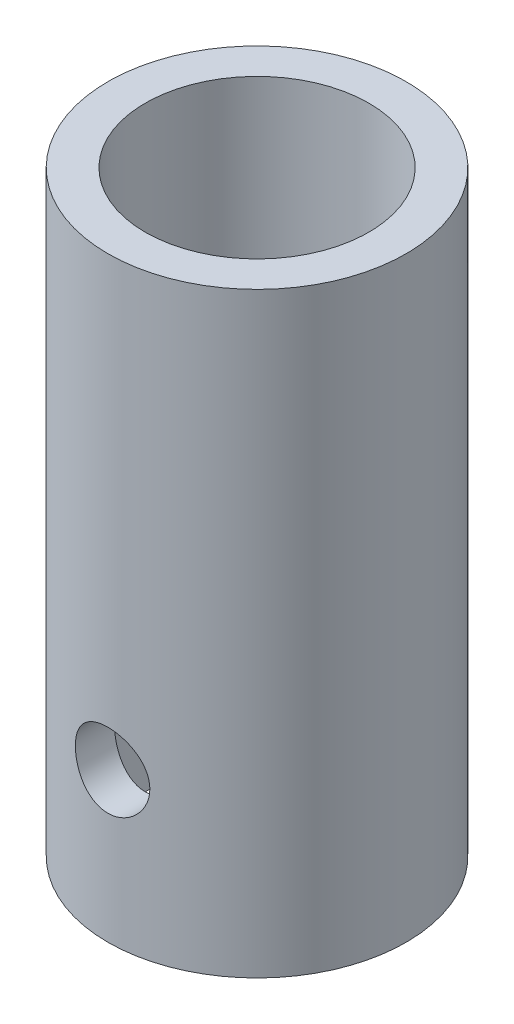
ISO-10303-21;
HEADER;
FILE_DESCRIPTION(('STEP AP214'),'2;1');
FILE_NAME('part.step','',(''),(''),'','','');
FILE_SCHEMA(('AUTOMOTIVE_DESIGN { 1 0 10303 214 1 1 1 1 }'));
ENDSEC;
DATA;
#1=APPLICATION_CONTEXT('core data for automotive mechanical design processes');
#2=APPLICATION_PROTOCOL_DEFINITION('international standard','automotive_design',2000,#1);
#3=PRODUCT_CONTEXT('',#1,'mechanical');
#4=PRODUCT('Part','Part','',(#3));
#5=PRODUCT_RELATED_PRODUCT_CATEGORY('part','',(#4));
#6=PRODUCT_DEFINITION_FORMATION('','',#4);
#7=PRODUCT_DEFINITION_CONTEXT('part definition',#1,'design');
#8=PRODUCT_DEFINITION('design','',#6,#7);
#9=PRODUCT_DEFINITION_SHAPE('','',#8);
#10=(LENGTH_UNIT() NAMED_UNIT(*) SI_UNIT(.MILLI.,.METRE.));
#11=(NAMED_UNIT(*) PLANE_ANGLE_UNIT() SI_UNIT($,.RADIAN.));
#12=(NAMED_UNIT(*) SI_UNIT($,.STERADIAN.) SOLID_ANGLE_UNIT());
#13=UNCERTAINTY_MEASURE_WITH_UNIT(LENGTH_MEASURE(1.E-05),#10,'distance_accuracy_value','');
#14=(GEOMETRIC_REPRESENTATION_CONTEXT(3) GLOBAL_UNCERTAINTY_ASSIGNED_CONTEXT((#13)) GLOBAL_UNIT_ASSIGNED_CONTEXT((#10,
#11,#12)) REPRESENTATION_CONTEXT('',''));
#15=CARTESIAN_POINT('',(0.,0.,0.));
#16=DIRECTION('',(0.,0.,1.));
#17=DIRECTION('',(1.,0.,0.));
#18=AXIS2_PLACEMENT_3D('',#15,#16,#17);
#19=CARTESIAN_POINT('',(0.,25.4,0.));
#20=DIRECTION('',(0.,-1.,0.));
#21=DIRECTION('',(0.,0.,-1.));
#22=AXIS2_PLACEMENT_3D('',#19,#20,#21);
#23=CYLINDRICAL_SURFACE('',#22,6.35);
#24=CARTESIAN_POINT('',(1.58362391918938,6.34666335865333,6.14936055883628));
#25=CARTESIAN_POINT('',(1.58362142804077,6.25900113181621,6.14936223070369));
#26=CARTESIAN_POINT('',(1.57633689179232,6.17131134799281,6.15125124674525));
#27=CARTESIAN_POINT('',(1.54743778276227,5.99844994651282,6.15858351143121));
#28=CARTESIAN_POINT('',(1.5258148699927,5.91327982456595,6.16402882858798));
#29=CARTESIAN_POINT('',(1.46898286926807,5.74798311190457,6.17781813686237));
#30=CARTESIAN_POINT('',(1.43379132022412,5.66785016498344,6.18615838459055));
#31=CARTESIAN_POINT('',(1.35087485555734,5.51461596729049,6.204791308229));
#32=CARTESIAN_POINT('',(1.3031494078251,5.44151501523239,6.21508406702529));
#33=CARTESIAN_POINT('',(1.19539862850032,5.30281121391184,6.23671333591491));
#34=CARTESIAN_POINT('',(1.13514803213944,5.23738592243106,6.24806650382458));
#35=CARTESIAN_POINT('',(1.00454312184846,5.11745487323452,6.27038874296898));
#36=CARTESIAN_POINT('',(0.934187864378619,5.06295013638353,6.28135777821556));
#37=CARTESIAN_POINT('',(0.784154833151758,4.96568093670748,6.30185720126364));
#38=CARTESIAN_POINT('',(0.704360676790673,4.92309090217081,6.31136537944955));
#39=CARTESIAN_POINT('',(0.538468427965106,4.85199423461613,6.32767634930814));
#40=CARTESIAN_POINT('',(0.452371267757947,4.82348552368699,6.33447954011349));
#41=CARTESIAN_POINT('',(0.278168465993106,4.78192948369594,6.34449182934285));
#42=CARTESIAN_POINT('',(0.190138846538763,4.76858063450596,6.3477709456588));
#43=CARTESIAN_POINT('',(0.0130330489116268,4.75677678781337,6.35060380004642));
#44=CARTESIAN_POINT('',(-0.0760429725854212,4.75831958830025,6.3501580889052));
#45=CARTESIAN_POINT('',(-0.250621867153979,4.77603838856218,6.34564017829661));
#46=CARTESIAN_POINT('',(-0.33616016788663,4.79188892506254,6.34164866831406));
#47=CARTESIAN_POINT('',(-0.503320196549588,4.83725011513414,6.33057578988879));
#48=CARTESIAN_POINT('',(-0.584941715735508,4.866761495868,6.32349425696623));
#49=CARTESIAN_POINT('',(-0.742808999055531,4.93886999103963,6.30690869240067));
#50=CARTESIAN_POINT('',(-0.818999527113211,4.98158293201355,6.29738335046241));
#51=CARTESIAN_POINT('',(-0.963244559989683,5.07879421489216,6.2769399322465));
#52=CARTESIAN_POINT('',(-1.03129764612226,5.13329460718933,6.26602161380036));
#53=CARTESIAN_POINT('',(-1.15927733149196,5.25427840981215,6.24363004496089));
#54=CARTESIAN_POINT('',(-1.21893414131746,5.32104621529418,6.23214977314634));
#55=CARTESIAN_POINT('',(-1.3262650046917,5.4637593418514,6.21019571756744));
#56=CARTESIAN_POINT('',(-1.37393849817685,5.53970509163012,6.19972198085959));
#57=CARTESIAN_POINT('',(-1.45612274548106,5.69914753033793,6.18093848139376));
#58=CARTESIAN_POINT('',(-1.49056855358063,5.78267904740222,6.17263945778912));
#59=CARTESIAN_POINT('',(-1.54484637858578,5.95460513088188,6.15928075804944));
#60=CARTESIAN_POINT('',(-1.56468152274533,6.04299865228263,6.15422038874604));
#61=CARTESIAN_POINT('',(-1.58872770945515,6.21963764212052,6.14805624014017));
#62=CARTESIAN_POINT('',(-1.59333758131407,6.30782535741765,6.14685148885473));
#63=CARTESIAN_POINT('',(-1.58789430608743,6.48371028838046,6.14825988579229));
#64=CARTESIAN_POINT('',(-1.57784250878539,6.57140754845237,6.15087268256398));
#65=CARTESIAN_POINT('',(-1.54371077952937,6.74234091689957,6.15952557947265));
#66=CARTESIAN_POINT('',(-1.5198630602805,6.82562654002582,6.1655089042144));
#67=CARTESIAN_POINT('',(-1.45907359247375,6.98701733438915,6.18017602724544));
#68=CARTESIAN_POINT('',(-1.42213029281037,7.06512189065347,6.18886014541515));
#69=CARTESIAN_POINT('',(-1.33536310364021,7.2156235700991,6.20816492617236));
#70=CARTESIAN_POINT('',(-1.28530075006727,7.2878786720807,6.21882023639275));
#71=CARTESIAN_POINT('',(-1.17401747509294,7.42310796903219,6.24078464766495));
#72=CARTESIAN_POINT('',(-1.11279471992705,7.48608063572613,6.25209385594985));
#73=CARTESIAN_POINT('',(-0.979097504806465,7.60257337068589,6.27443755852852));
#74=CARTESIAN_POINT('',(-0.906379842498467,7.65581749837183,6.28545809886533));
#75=CARTESIAN_POINT('',(-0.752803102319258,7.74933763416737,6.30569403103555));
#76=CARTESIAN_POINT('',(-0.671944449396614,7.78961431869954,6.31490951701644));
#77=CARTESIAN_POINT('',(-0.504939290764076,7.85570659057856,6.33044319223343));
#78=CARTESIAN_POINT('',(-0.418835966706882,7.88162617923403,6.33678215647187));
#79=CARTESIAN_POINT('',(-0.243315609654991,7.91858067112967,6.3459444941383));
#80=CARTESIAN_POINT('',(-0.153899219594284,7.92961844695263,6.34876854602908));
#81=CARTESIAN_POINT('',(0.0231168776108621,7.93633440710449,6.35055827340179));
#82=CARTESIAN_POINT('',(0.110700334641228,7.93241982184226,6.34962620888379));
#83=CARTESIAN_POINT('',(0.283921713785359,7.91027493282358,6.3442413435651));
#84=CARTESIAN_POINT('',(0.369559693681864,7.89204505482003,6.33978864747193));
#85=CARTESIAN_POINT('',(0.536032694334273,7.84200545976698,6.3278829047533));
#86=CARTESIAN_POINT('',(0.616891089402648,7.81026937651636,6.32044613920833));
#87=CARTESIAN_POINT('',(0.772182502638156,7.73418506446015,6.30335972746361));
#88=CARTESIAN_POINT('',(0.84661470929115,7.68983524579039,6.29370980234186));
#89=CARTESIAN_POINT('',(0.988871453471745,7.58854042468297,6.27295219363901));
#90=CARTESIAN_POINT('',(1.05649496997758,7.53131913178787,6.2618151248361));
#91=CARTESIAN_POINT('',(1.1813183797575,7.40644208114492,6.23947246550605));
#92=CARTESIAN_POINT('',(1.23851562620748,7.3387836818479,6.22826685832379));
#93=CARTESIAN_POINT('',(1.34190986676171,7.19343361360871,6.20682081724193));
#94=CARTESIAN_POINT('',(1.38788173372283,7.11557831273578,6.19660228959538));
#95=CARTESIAN_POINT('',(1.46601442146359,6.95300026840104,6.17858565896494));
#96=CARTESIAN_POINT('',(1.49818529055041,6.86828257495888,6.17078579613687));
#97=CARTESIAN_POINT('',(1.54301315091853,6.71087235237842,6.1597104500703));
#98=CARTESIAN_POINT('',(1.55820897632704,6.63893296019395,6.15585850224399));
#99=CARTESIAN_POINT('',(1.57851497402488,6.49355652911589,6.15068296399581));
#100=CARTESIAN_POINT('',(1.58362600663875,6.4201196185143,6.14935915790077));
#101=CARTESIAN_POINT('',(1.58362391918938,6.34666335865333,6.14936055883628));
#102=B_SPLINE_CURVE_WITH_KNOTS('',3,(#24,#25,#26,#27,#28,#29,#30,#31,#32,#33,#34,#35,#36,#37,
#38,#39,#40,#41,#42,#43,#44,#45,#46,#47,#48,#49,#50,#51,#52,#53,#54,#55,#56,#57,#58,#59,#60,#61,
#62,#63,#64,#65,#66,#67,#68,#69,#70,#71,#72,#73,#74,#75,#76,#77,#78,#79,#80,#81,#82,#83,#84,#85,
#86,#87,#88,#89,#90,#91,#92,#93,#94,#95,#96,#97,#98,#99,#100,#101),.UNSPECIFIED.,.T.,.F.,(4,2,2,
2,2,2,2,2,2,2,2,2,2,2,2,2,2,2,2,2,2,2,2,2,2,2,2,2,2,2,2,2,2,2,2,2,2,2,4),(0.,0.262716925502446,
0.525586795807201,0.788118011750421,1.05066037489728,1.31841210912539,1.58618886139715,
1.85770200212678,2.12917506502903,2.39514856882044,2.66108274402922,2.9211159680748,
3.18116303520238,3.44355975151571,3.70600214772758,3.97554746273162,4.24510537311873,
4.51597034325334,4.78677732082261,5.05043169973688,5.31406180761712,5.57337852180844,
5.83272596102598,6.09716107120562,6.36163966992001,6.63273585162975,6.90381788981913,
7.17290966232397,7.44194948557236,7.70371488290932,7.96547249534379,8.22582096615413,
8.48620226643672,8.75282156329611,9.01950845044094,9.29117063075766,9.56263468067799,
9.782796202576,10.0029389418819),.UNSPECIFIED.);
#103=CARTESIAN_POINT('',(1.58362391918938,6.34666335865333,6.14936055883628));
#104=VERTEX_POINT('',#103);
#105=EDGE_CURVE('E47',#104,#104,#102,.T.);
#106=ORIENTED_EDGE('',*,*,#105,.T.);
#107=EDGE_LOOP('',(#106));
#108=FACE_BOUND('',#107,.T.);
#109=CARTESIAN_POINT('',(0.,25.4,0.));
#110=DIRECTION('',(0.,1.,0.));
#111=DIRECTION('',(0.,0.,1.));
#112=AXIS2_PLACEMENT_3D('',#109,#110,#111);
#113=CIRCLE('',#112,6.35);
#114=CARTESIAN_POINT('',(0.,25.4,6.35));
#115=VERTEX_POINT('',#114);
#116=EDGE_CURVE('E10',#115,#115,#113,.T.);
#117=ORIENTED_EDGE('',*,*,#116,.F.);
#118=EDGE_LOOP('',(#117));
#119=FACE_BOUND('',#118,.T.);
#120=CARTESIAN_POINT('',(0.,0.,0.));
#121=DIRECTION('',(0.,1.,0.));
#122=DIRECTION('',(0.,0.,1.));
#123=AXIS2_PLACEMENT_3D('',#120,#121,#122);
#124=CIRCLE('',#123,6.35);
#125=CARTESIAN_POINT('',(0.,0.,6.35));
#126=VERTEX_POINT('',#125);
#127=EDGE_CURVE('E35',#126,#126,#124,.T.);
#128=ORIENTED_EDGE('',*,*,#127,.T.);
#129=EDGE_LOOP('',(#128));
#130=FACE_BOUND('',#129,.T.);
#131=ADVANCED_FACE('F31',(#108,#119,#130),#23,.T.);
#132=CARTESIAN_POINT('',(0.,25.4,0.));
#133=DIRECTION('',(0.,1.,0.));
#134=DIRECTION('',(0.,0.,1.));
#135=AXIS2_PLACEMENT_3D('',#132,#133,#134);
#136=PLANE('',#135);
#137=CARTESIAN_POINT('',(0.,25.4,0.));
#138=DIRECTION('',(0.,1.,0.));
#139=DIRECTION('',(0.,0.,1.));
#140=AXIS2_PLACEMENT_3D('',#137,#138,#139);
#141=CIRCLE('',#140,4.7625);
#142=CARTESIAN_POINT('',(0.,25.4,4.7625));
#143=VERTEX_POINT('',#142);
#144=EDGE_CURVE('E44',#143,#143,#141,.T.);
#145=ORIENTED_EDGE('',*,*,#144,.F.);
#146=EDGE_LOOP('',(#145));
#147=FACE_BOUND('',#146,.T.);
#148=ORIENTED_EDGE('',*,*,#116,.T.);
#149=EDGE_LOOP('',(#148));
#150=FACE_BOUND('',#149,.T.);
#151=ADVANCED_FACE('F71',(#147,#150),#136,.T.);
#152=CARTESIAN_POINT('',(0.,0.,0.));
#153=DIRECTION('',(0.,1.,0.));
#154=DIRECTION('',(0.,0.,1.));
#155=AXIS2_PLACEMENT_3D('',#152,#153,#154);
#156=PLANE('',#155);
#157=CARTESIAN_POINT('',(0.,0.,0.));
#158=DIRECTION('',(0.,1.,0.));
#159=DIRECTION('',(0.,0.,1.));
#160=AXIS2_PLACEMENT_3D('',#157,#158,#159);
#161=CIRCLE('',#160,4.7625);
#162=CARTESIAN_POINT('',(0.,0.,4.7625));
#163=VERTEX_POINT('',#162);
#164=EDGE_CURVE('E42',#163,#163,#161,.T.);
#165=ORIENTED_EDGE('',*,*,#164,.T.);
#166=EDGE_LOOP('',(#165));
#167=FACE_BOUND('',#166,.T.);
#168=ORIENTED_EDGE('',*,*,#127,.F.);
#169=EDGE_LOOP('',(#168));
#170=FACE_BOUND('',#169,.T.);
#171=ADVANCED_FACE('F69',(#167,#170),#156,.F.);
#172=CARTESIAN_POINT('',(0.,0.,0.));
#173=DIRECTION('',(0.,1.,0.));
#174=DIRECTION('',(0.,0.,1.));
#175=AXIS2_PLACEMENT_3D('',#172,#173,#174);
#176=CYLINDRICAL_SURFACE('',#175,4.7625);
#177=CARTESIAN_POINT('',(0.,4.75916619737539,4.7625));
#178=CARTESIAN_POINT('',(0.0866375884449755,4.75932964941258,4.76250023471116));
#179=CARTESIAN_POINT('',(0.173259369523679,4.76660932043762,4.76011407957471));
#180=CARTESIAN_POINT('',(0.343924440548233,4.79511899233046,4.75083465902417));
#181=CARTESIAN_POINT('',(0.427967452450889,4.81635049199247,4.74394090937599));
#182=CARTESIAN_POINT('',(0.59099047417394,4.87195568113305,4.72639961982016));
#183=CARTESIAN_POINT('',(0.669978729313986,4.90630729626126,4.71575838731405));
#184=CARTESIAN_POINT('',(0.82107552779938,4.98707957027542,4.6918120857758));
#185=CARTESIAN_POINT('',(0.893182712697829,5.0335026055663,4.67850649235073));
#186=CARTESIAN_POINT('',(1.03097343171799,5.13879414595907,4.65011897553573));
#187=CARTESIAN_POINT('',(1.09638518867134,5.19800677880209,4.63499448197467));
#188=CARTESIAN_POINT('',(1.21655563487985,5.32645985559915,4.60491513610117));
#189=CARTESIAN_POINT('',(1.27131199625831,5.39570248504866,4.5899603215289));
#190=CARTESIAN_POINT('',(1.37013748249353,5.54466410853846,4.5614533481839));
#191=CARTESIAN_POINT('',(1.41385834888345,5.62462505631073,4.54795318092715));
#192=CARTESIAN_POINT('',(1.48711238353633,5.79128911035693,4.52453235586475));
#193=CARTESIAN_POINT('',(1.51664992846074,5.87799012718602,4.51461059407731));
#194=CARTESIAN_POINT('',(1.55968270275565,6.05256460824841,4.49992227213732));
#195=CARTESIAN_POINT('',(1.57368979030624,6.14029769824114,4.49499172434743));
#196=CARTESIAN_POINT('',(1.58686110985164,6.31699647025926,4.49035985500388));
#197=CARTESIAN_POINT('',(1.58602988525365,6.40596176665329,4.49065693278046));
#198=CARTESIAN_POINT('',(1.56995004141307,6.57830335945587,4.49630120702736));
#199=CARTESIAN_POINT('',(1.55535883136793,6.66174982734714,4.50141811425341));
#200=CARTESIAN_POINT('',(1.51323895034653,6.82493628482837,4.51575065817019));
#201=CARTESIAN_POINT('',(1.48570870931021,6.90467582331788,4.52496679226588));
#202=CARTESIAN_POINT('',(1.41804222373408,7.05972051887558,4.54662929775322));
#203=CARTESIAN_POINT('',(1.37770523207145,7.13493065263251,4.55912651979595));
#204=CARTESIAN_POINT('',(1.28571174339267,7.27772631197311,4.58591776727508));
#205=CARTESIAN_POINT('',(1.23405197175312,7.34530962324558,4.60021231199825));
#206=CARTESIAN_POINT('',(1.11769746421279,7.47463891246053,4.62989647046695));
#207=CARTESIAN_POINT('',(1.05246327424146,7.53589637610524,4.64530430718899));
#208=CARTESIAN_POINT('',(0.912453376034545,7.64672867032833,4.67482056088084));
#209=CARTESIAN_POINT('',(0.837676782419312,7.69630241563132,4.68892885706506));
#210=CARTESIAN_POINT('',(0.679703939327754,7.78273035875108,4.71443124175798));
#211=CARTESIAN_POINT('',(0.596434357838018,7.81945906357164,4.72579823201317));
#212=CARTESIAN_POINT('',(0.424429310176062,7.8782375718764,4.74433705651035));
#213=CARTESIAN_POINT('',(0.335695759915974,7.90029248898525,4.7515103520947));
#214=CARTESIAN_POINT('',(0.159426853173243,7.92824086236792,4.76061316349732));
#215=CARTESIAN_POINT('',(0.0720072680716217,7.93479557983306,4.76275720068059));
#216=CARTESIAN_POINT('',(-0.102694793986046,7.9334351893384,4.76219336491809));
#217=CARTESIAN_POINT('',(-0.189977291357451,7.92552249180544,4.75948630021952));
#218=CARTESIAN_POINT('',(-0.359320387015078,7.89597503065636,4.74966206434999));
#219=CARTESIAN_POINT('',(-0.441458954072639,7.87474021030022,4.74267356495418));
#220=CARTESIAN_POINT('',(-0.600973637265377,7.81964750028253,4.72511177771382));
#221=CARTESIAN_POINT('',(-0.678349137886069,7.7857879831485,4.71453802770407));
#222=CARTESIAN_POINT('',(-0.828434436363635,7.70540678292973,4.69052616644362));
#223=CARTESIAN_POINT('',(-0.900965366356726,7.65857222858394,4.67701934150664));
#224=CARTESIAN_POINT('',(-1.03735276263303,7.5539417060699,4.64867354621723));
#225=CARTESIAN_POINT('',(-1.10120656638089,7.49614238639167,4.63383416928685));
#226=CARTESIAN_POINT('',(-1.22143918799154,7.36812300178344,4.60364111755734));
#227=CARTESIAN_POINT('',(-1.2773478725195,7.29745862509093,4.58829462703688));
#228=CARTESIAN_POINT('',(-1.37657020423088,7.14741632503124,4.55951078422658));
#229=CARTESIAN_POINT('',(-1.41988379690134,7.06803836395275,4.54607344019986));
#230=CARTESIAN_POINT('',(-1.49246823950069,6.90282496206313,4.52276499592308));
#231=CARTESIAN_POINT('',(-1.5217732345427,6.81700581873328,4.51288523893642));
#232=CARTESIAN_POINT('',(-1.56538690410331,6.64124580973359,4.49794531482857));
#233=CARTESIAN_POINT('',(-1.57970233121555,6.55130681907368,4.49288297762));
#234=CARTESIAN_POINT('',(-1.5924155636813,6.37483905605659,4.4883916241911));
#235=CARTESIAN_POINT('',(-1.59159451524922,6.28837293765333,4.48868614617857));
#236=CARTESIAN_POINT('',(-1.57597298461515,6.11688051265898,4.49419430131608));
#237=CARTESIAN_POINT('',(-1.56117329533551,6.0318541246793,4.49940765545101));
#238=CARTESIAN_POINT('',(-1.51856098245415,5.86722297258575,4.51396364919856));
#239=CARTESIAN_POINT('',(-1.49099521724791,5.787546832378,4.52322777683882));
#240=CARTESIAN_POINT('',(-1.42383096669286,5.63388845807341,4.54481574528493));
#241=CARTESIAN_POINT('',(-1.38422979820836,5.55990749825655,4.55714026825367));
#242=CARTESIAN_POINT('',(-1.29209034396791,5.41622304012935,4.58413640230926));
#243=CARTESIAN_POINT('',(-1.23906070443208,5.34684959651731,4.59888726305922));
#244=CARTESIAN_POINT('',(-1.1224066129477,5.21773615362356,4.62873957736873));
#245=CARTESIAN_POINT('',(-1.05877917482195,5.1579988789228,4.64384112870849));
#246=CARTESIAN_POINT('',(-0.919777409106653,5.04752589942073,4.67339802543801));
#247=CARTESIAN_POINT('',(-0.844043831591846,4.99722790243851,4.68780576131404));
#248=CARTESIAN_POINT('',(-0.684719761424352,4.91013524338824,4.7137104400785));
#249=CARTESIAN_POINT('',(-0.601131321683746,4.87333706532877,4.72520814063553));
#250=CARTESIAN_POINT('',(-0.432377316509446,4.81585838903318,4.74355633315458));
#251=CARTESIAN_POINT('',(-0.347456053483601,4.79452142149595,4.75059427154295));
#252=CARTESIAN_POINT('',(-0.1750173409018,4.76609473513282,4.76006535633134));
#253=CARTESIAN_POINT('',(-0.0875006085221239,4.75900111714896,4.76249976295083));
#254=CARTESIAN_POINT('',(0.,4.75916619737539,4.7625));
#255=B_SPLINE_CURVE_WITH_KNOTS('',3,(#177,#178,#179,#180,#181,#182,#183,#184,#185,#186,#187,
#188,#189,#190,#191,#192,#193,#194,#195,#196,#197,#198,#199,#200,#201,#202,#203,#204,#205,#206,
#207,#208,#209,#210,#211,#212,#213,#214,#215,#216,#217,#218,#219,#220,#221,#222,#223,#224,#225,
#226,#227,#228,#229,#230,#231,#232,#233,#234,#235,#236,#237,#238,#239,#240,#241,#242,#243,#244,
#245,#246,#247,#248,#249,#250,#251,#252,#253,#254),.UNSPECIFIED.,.T.,.F.,(4,2,2,2,2,2,2,2,2,2,2,
2,2,2,2,2,2,2,2,2,2,2,2,2,2,2,2,2,2,2,2,2,2,2,2,2,2,2,4),(0.,0.259591076094502,
0.519210043673938,0.778394117754759,1.03762925403176,1.30498020889948,1.57238950632807,
1.84740440225545,2.12233438000432,2.38790567175348,2.65339564847156,2.90681138360756,
3.16025787689606,3.41789150634392,3.67559974370026,3.94675338993767,4.21793221313446,
4.49169087276396,4.76535408101255,5.02711349572567,5.28882930248075,5.54304120687141,
5.79728589351495,6.05829384667602,6.31938170892234,6.59230635430429,6.86523218091665,
7.13748933169095,7.40962378153782,7.66775542599622,7.92587242911284,8.17919420865218,
8.4325725044464,8.69706698644153,8.96163612240493,9.23644173712738,9.51117572857135,
9.77342446160429,10.0356013934981),.UNSPECIFIED.);
#256=CARTESIAN_POINT('',(0.,4.75916619737539,4.7625));
#257=VERTEX_POINT('',#256);
#258=EDGE_CURVE('E55',#257,#257,#255,.T.);
#259=ORIENTED_EDGE('',*,*,#258,.T.);
#260=EDGE_LOOP('',(#259));
#261=FACE_BOUND('',#260,.T.);
#262=ORIENTED_EDGE('',*,*,#164,.F.);
#263=EDGE_LOOP('',(#262));
#264=FACE_BOUND('',#263,.T.);
#265=ORIENTED_EDGE('',*,*,#144,.T.);
#266=EDGE_LOOP('',(#265));
#267=FACE_BOUND('',#266,.T.);
#268=ADVANCED_FACE('F62',(#261,#264,#267),#176,.F.);
#269=CARTESIAN_POINT('',(-0.0040028732900127,6.34666335865333,6.34999873834676));
#270=DIRECTION('',(-0.00063037374645834,0.,0.99999980131445));
#271=DIRECTION('',(0.99999980131445,0.,0.00063037374645834));
#272=AXIS2_PLACEMENT_3D('',#269,#270,#271);
#273=CYLINDRICAL_SURFACE('',#272,1.58749999999999);
#274=ORIENTED_EDGE('',*,*,#258,.F.);
#275=EDGE_LOOP('',(#274));
#276=FACE_BOUND('',#275,.T.);
#277=ORIENTED_EDGE('',*,*,#105,.F.);
#278=EDGE_LOOP('',(#277));
#279=FACE_BOUND('',#278,.T.);
#280=ADVANCED_FACE('F59',(#276,#279),#273,.F.);
#281=CLOSED_SHELL('',(#131,#151,#171,#268,#280));
#282=MANIFOLD_SOLID_BREP('B2',#281);
#283=ADVANCED_BREP_SHAPE_REPRESENTATION('',(#18,#282),#14);
#284=SHAPE_DEFINITION_REPRESENTATION(#9,#283);
ENDSEC;
END-ISO-10303-21;
